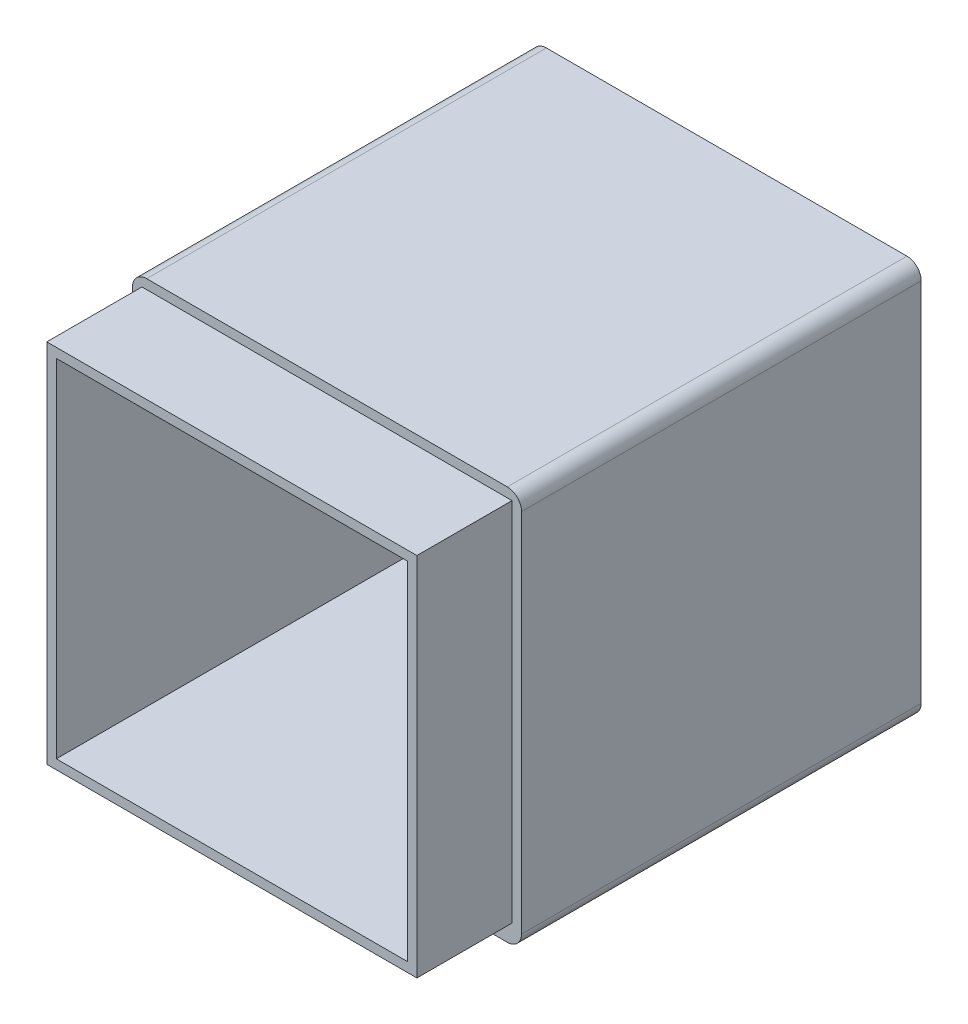
ISO-10303-21;
HEADER;
FILE_DESCRIPTION(('STEP AP214'),'2;1');
FILE_NAME('part.step','',(''),(''),'','','');
FILE_SCHEMA(('AUTOMOTIVE_DESIGN { 1 0 10303 214 1 1 1 1 }'));
ENDSEC;
DATA;
#1=APPLICATION_CONTEXT('core data for automotive mechanical design processes');
#2=APPLICATION_PROTOCOL_DEFINITION('international standard','automotive_design',2000,#1);
#3=PRODUCT_CONTEXT('',#1,'mechanical');
#4=PRODUCT('Part','Part','',(#3));
#5=PRODUCT_RELATED_PRODUCT_CATEGORY('part','',(#4));
#6=PRODUCT_DEFINITION_FORMATION('','',#4);
#7=PRODUCT_DEFINITION_CONTEXT('part definition',#1,'design');
#8=PRODUCT_DEFINITION('design','',#6,#7);
#9=PRODUCT_DEFINITION_SHAPE('','',#8);
#10=(LENGTH_UNIT() NAMED_UNIT(*) SI_UNIT(.MILLI.,.METRE.));
#11=(NAMED_UNIT(*) PLANE_ANGLE_UNIT() SI_UNIT($,.RADIAN.));
#12=(NAMED_UNIT(*) SI_UNIT($,.STERADIAN.) SOLID_ANGLE_UNIT());
#13=UNCERTAINTY_MEASURE_WITH_UNIT(LENGTH_MEASURE(1.E-05),#10,'distance_accuracy_value','');
#14=(GEOMETRIC_REPRESENTATION_CONTEXT(3) GLOBAL_UNCERTAINTY_ASSIGNED_CONTEXT((#13)) GLOBAL_UNIT_ASSIGNED_CONTEXT((#10,
#11,#12)) REPRESENTATION_CONTEXT('',''));
#15=CARTESIAN_POINT('',(0.,0.,0.));
#16=DIRECTION('',(0.,0.,1.));
#17=DIRECTION('',(1.,0.,0.));
#18=AXIS2_PLACEMENT_3D('',#15,#16,#17);
#19=CARTESIAN_POINT('',(0.,0.,80.));
#20=DIRECTION('',(0.,0.,1.));
#21=DIRECTION('',(1.,0.,0.));
#22=AXIS2_PLACEMENT_3D('',#19,#20,#21);
#23=PLANE('',#22);
#24=CARTESIAN_POINT('',(-37.8935,37.449,80.));
#25=DIRECTION('',(0.,0.,1.));
#26=DIRECTION('',(1.,0.,0.));
#27=AXIS2_PLACEMENT_3D('',#24,#25,#26);
#28=CIRCLE('',#27,3.);
#29=CARTESIAN_POINT('',(-40.8935,37.449,80.));
#30=VERTEX_POINT('',#29);
#31=CARTESIAN_POINT('',(-37.8935,40.449,80.));
#32=VERTEX_POINT('',#31);
#33=EDGE_CURVE('E258',#30,#32,#28,.F.);
#34=ORIENTED_EDGE('',*,*,#33,.F.);
#35=DIRECTION('',(0.,-1.,0.));
#36=VECTOR('',#35,1.);
#37=CARTESIAN_POINT('',(-40.8935,36.449,80.));
#38=LINE('',#37,#36);
#39=CARTESIAN_POINT('',(-40.8935,-39.449,80.));
#40=VERTEX_POINT('',#39);
#41=EDGE_CURVE('E266',#30,#40,#38,.T.);
#42=ORIENTED_EDGE('',*,*,#41,.T.);
#43=CARTESIAN_POINT('',(-37.8935,-39.449,80.));
#44=DIRECTION('',(0.,0.,1.));
#45=DIRECTION('',(1.,0.,0.));
#46=AXIS2_PLACEMENT_3D('',#43,#44,#45);
#47=CIRCLE('',#46,3.);
#48=CARTESIAN_POINT('',(-37.8935,-42.449,80.));
#49=VERTEX_POINT('',#48);
#50=EDGE_CURVE('E256',#49,#40,#47,.F.);
#51=ORIENTED_EDGE('',*,*,#50,.F.);
#52=DIRECTION('',(-1.,0.,0.));
#53=VECTOR('',#52,1.);
#54=CARTESIAN_POINT('',(0.,-42.449,80.));
#55=LINE('',#54,#53);
#56=CARTESIAN_POINT('',(37.8935,-42.449,80.));
#57=VERTEX_POINT('',#56);
#58=EDGE_CURVE('E260',#57,#49,#55,.T.);
#59=ORIENTED_EDGE('',*,*,#58,.F.);
#60=CARTESIAN_POINT('',(37.8935,-39.449,80.));
#61=DIRECTION('',(0.,0.,1.));
#62=DIRECTION('',(1.,0.,0.));
#63=AXIS2_PLACEMENT_3D('',#60,#61,#62);
#64=CIRCLE('',#63,3.);
#65=CARTESIAN_POINT('',(40.8935,-39.449,80.));
#66=VERTEX_POINT('',#65);
#67=EDGE_CURVE('E251',#66,#57,#64,.F.);
#68=ORIENTED_EDGE('',*,*,#67,.F.);
#69=DIRECTION('',(0.,1.,0.));
#70=VECTOR('',#69,1.);
#71=CARTESIAN_POINT('',(40.8935,36.449,80.));
#72=LINE('',#71,#70);
#73=CARTESIAN_POINT('',(40.8935,37.449,80.));
#74=VERTEX_POINT('',#73);
#75=EDGE_CURVE('E211',#66,#74,#72,.T.);
#76=ORIENTED_EDGE('',*,*,#75,.T.);
#77=CARTESIAN_POINT('',(37.8935,37.449,80.));
#78=DIRECTION('',(0.,0.,1.));
#79=DIRECTION('',(1.,0.,0.));
#80=AXIS2_PLACEMENT_3D('',#77,#78,#79);
#81=CIRCLE('',#80,3.);
#82=CARTESIAN_POINT('',(37.8935,40.449,80.));
#83=VERTEX_POINT('',#82);
#84=EDGE_CURVE('E254',#83,#74,#81,.F.);
#85=ORIENTED_EDGE('',*,*,#84,.F.);
#86=DIRECTION('',(-1.,0.,0.));
#87=VECTOR('',#86,1.);
#88=CARTESIAN_POINT('',(-36.8935,40.449,80.));
#89=LINE('',#88,#87);
#90=EDGE_CURVE('E263',#83,#32,#89,.T.);
#91=ORIENTED_EDGE('',*,*,#90,.T.);
#92=EDGE_LOOP('',(#34,#42,#51,#59,#68,#76,#85,#91));
#93=FACE_BOUND('',#92,.T.);
#94=DIRECTION('',(0.,-1.,0.));
#95=VECTOR('',#94,1.);
#96=CARTESIAN_POINT('',(-38.8935,38.449,80.));
#97=LINE('',#96,#95);
#98=CARTESIAN_POINT('',(-38.8935,38.449,80.));
#99=VERTEX_POINT('',#98);
#100=CARTESIAN_POINT('',(-38.8935,-38.449,80.));
#101=VERTEX_POINT('',#100);
#102=EDGE_CURVE('E198',#99,#101,#97,.T.);
#103=ORIENTED_EDGE('',*,*,#102,.F.);
#104=DIRECTION('',(-1.,0.,0.));
#105=VECTOR('',#104,1.);
#106=CARTESIAN_POINT('',(38.8935,38.449,80.));
#107=LINE('',#106,#105);
#108=CARTESIAN_POINT('',(38.8935,38.449,80.));
#109=VERTEX_POINT('',#108);
#110=EDGE_CURVE('E184',#109,#99,#107,.T.);
#111=ORIENTED_EDGE('',*,*,#110,.F.);
#112=DIRECTION('',(0.,1.,0.));
#113=VECTOR('',#112,1.);
#114=CARTESIAN_POINT('',(38.8935,-38.449,80.));
#115=LINE('',#114,#113);
#116=CARTESIAN_POINT('',(38.8935,-38.449,80.));
#117=VERTEX_POINT('',#116);
#118=EDGE_CURVE('E189',#117,#109,#115,.T.);
#119=ORIENTED_EDGE('',*,*,#118,.F.);
#120=DIRECTION('',(1.,0.,0.));
#121=VECTOR('',#120,1.);
#122=CARTESIAN_POINT('',(-38.8935,-38.449,80.));
#123=LINE('',#122,#121);
#124=EDGE_CURVE('E200',#101,#117,#123,.T.);
#125=ORIENTED_EDGE('',*,*,#124,.F.);
#126=EDGE_LOOP('',(#103,#111,#119,#125));
#127=FACE_BOUND('',#126,.T.);
#128=ADVANCED_FACE('F43',(#93,#127),#23,.T.);
#129=CARTESIAN_POINT('',(-22.225,-37.449,15.0499999999999));
#130=DIRECTION('',(0.,-1.,0.));
#131=DIRECTION('',(1.,0.,0.));
#132=AXIS2_PLACEMENT_3D('',#129,#130,#131);
#133=PLANE('',#132);
#134=CARTESIAN_POINT('',(-22.225,-37.449,15.0499999999999));
#135=DIRECTION('',(0.,-1.,0.));
#136=DIRECTION('',(1.,0.,0.));
#137=AXIS2_PLACEMENT_3D('',#134,#135,#136);
#138=CIRCLE('',#137,3.025);
#139=CARTESIAN_POINT('',(-19.2,-37.449,15.0499999999999));
#140=VERTEX_POINT('',#139);
#141=EDGE_CURVE('E244',#140,#140,#138,.T.);
#142=ORIENTED_EDGE('',*,*,#141,.T.);
#143=EDGE_LOOP('',(#142));
#144=FACE_BOUND('',#143,.T.);
#145=ADVANCED_FACE('F308',(#144),#133,.T.);
#146=CARTESIAN_POINT('',(22.225,-37.449,15.0499999999999));
#147=DIRECTION('',(0.,-1.,0.));
#148=DIRECTION('',(1.,0.,0.));
#149=AXIS2_PLACEMENT_3D('',#146,#147,#148);
#150=PLANE('',#149);
#151=CARTESIAN_POINT('',(22.225,-37.449,15.0499999999999));
#152=DIRECTION('',(0.,-1.,0.));
#153=DIRECTION('',(1.,0.,0.));
#154=AXIS2_PLACEMENT_3D('',#151,#152,#153);
#155=CIRCLE('',#154,3.025);
#156=CARTESIAN_POINT('',(25.25,-37.449,15.0499999999999));
#157=VERTEX_POINT('',#156);
#158=EDGE_CURVE('E11',#157,#157,#155,.T.);
#159=ORIENTED_EDGE('',*,*,#158,.T.);
#160=EDGE_LOOP('',(#159));
#161=FACE_BOUND('',#160,.T.);
#162=ADVANCED_FACE('F314',(#161),#150,.T.);
#163=CARTESIAN_POINT('',(-22.225,-37.449,15.0499999999999));
#164=DIRECTION('',(0.,-1.,0.));
#165=DIRECTION('',(1.,0.,0.));
#166=AXIS2_PLACEMENT_3D('',#163,#164,#165);
#167=CYLINDRICAL_SURFACE('',#166,3.025);
#168=ORIENTED_EDGE('',*,*,#141,.F.);
#169=EDGE_LOOP('',(#168));
#170=FACE_BOUND('',#169,.T.);
#171=CARTESIAN_POINT('',(-22.225,-42.449,15.0499999999999));
#172=DIRECTION('',(0.,-1.,0.));
#173=DIRECTION('',(1.,0.,0.));
#174=AXIS2_PLACEMENT_3D('',#171,#172,#173);
#175=CIRCLE('',#174,3.025);
#176=CARTESIAN_POINT('',(-19.2,-42.449,15.0499999999999));
#177=VERTEX_POINT('',#176);
#178=EDGE_CURVE('E243',#177,#177,#175,.T.);
#179=ORIENTED_EDGE('',*,*,#178,.T.);
#180=EDGE_LOOP('',(#179));
#181=FACE_BOUND('',#180,.T.);
#182=ADVANCED_FACE('F323',(#170,#181),#167,.F.);
#183=CARTESIAN_POINT('',(22.225,-37.449,15.0499999999999));
#184=DIRECTION('',(0.,-1.,0.));
#185=DIRECTION('',(1.,0.,0.));
#186=AXIS2_PLACEMENT_3D('',#183,#184,#185);
#187=CYLINDRICAL_SURFACE('',#186,3.025);
#188=ORIENTED_EDGE('',*,*,#158,.F.);
#189=EDGE_LOOP('',(#188));
#190=FACE_BOUND('',#189,.T.);
#191=CARTESIAN_POINT('',(22.225,-42.449,15.0499999999999));
#192=DIRECTION('',(0.,-1.,0.));
#193=DIRECTION('',(1.,0.,0.));
#194=AXIS2_PLACEMENT_3D('',#191,#192,#193);
#195=CIRCLE('',#194,3.025);
#196=CARTESIAN_POINT('',(25.25,-42.449,15.0499999999999));
#197=VERTEX_POINT('',#196);
#198=EDGE_CURVE('E52',#197,#197,#195,.T.);
#199=ORIENTED_EDGE('',*,*,#198,.T.);
#200=EDGE_LOOP('',(#199));
#201=FACE_BOUND('',#200,.T.);
#202=ADVANCED_FACE('F319',(#190,#201),#187,.F.);
#203=CARTESIAN_POINT('',(-40.8935,36.449,123.698));
#204=DIRECTION('',(1.,0.,0.));
#205=DIRECTION('',(0.,1.,0.));
#206=AXIS2_PLACEMENT_3D('',#203,#204,#205);
#207=PLANE('',#206);
#208=ORIENTED_EDGE('',*,*,#41,.F.);
#209=DIRECTION('',(0.,0.,-1.));
#210=VECTOR('',#209,1.);
#211=CARTESIAN_POINT('',(-40.8935,37.449,123.698));
#212=LINE('',#211,#210);
#213=CARTESIAN_POINT('',(-40.8935,37.449,-4.));
#214=VERTEX_POINT('',#213);
#215=EDGE_CURVE('E221',#30,#214,#212,.T.);
#216=ORIENTED_EDGE('',*,*,#215,.T.);
#217=DIRECTION('',(0.,-1.,0.));
#218=VECTOR('',#217,1.);
#219=CARTESIAN_POINT('',(-40.8935,0.,-4.));
#220=LINE('',#219,#218);
#221=CARTESIAN_POINT('',(-40.8935,-39.449,-4.));
#222=VERTEX_POINT('',#221);
#223=EDGE_CURVE('E225',#214,#222,#220,.T.);
#224=ORIENTED_EDGE('',*,*,#223,.T.);
#225=DIRECTION('',(0.,0.,-1.));
#226=VECTOR('',#225,1.);
#227=CARTESIAN_POINT('',(-40.8935,-39.449,128.698));
#228=LINE('',#227,#226);
#229=EDGE_CURVE('E226',#222,#40,#228,.F.);
#230=ORIENTED_EDGE('',*,*,#229,.T.);
#231=EDGE_LOOP('',(#208,#216,#224,#230));
#232=FACE_BOUND('',#231,.T.);
#233=ADVANCED_FACE('F322',(#232),#207,.F.);
#234=CARTESIAN_POINT('',(0.,0.,-4.));
#235=DIRECTION('',(0.,0.,-1.));
#236=DIRECTION('',(-1.,0.,0.));
#237=AXIS2_PLACEMENT_3D('',#234,#235,#236);
#238=PLANE('',#237);
#239=ORIENTED_EDGE('',*,*,#223,.F.);
#240=CARTESIAN_POINT('',(-37.8935,37.449,-4.));
#241=DIRECTION('',(0.,0.,-1.));
#242=DIRECTION('',(-1.,0.,0.));
#243=AXIS2_PLACEMENT_3D('',#240,#241,#242);
#244=CIRCLE('',#243,3.);
#245=CARTESIAN_POINT('',(-37.8935,40.449,-4.));
#246=VERTEX_POINT('',#245);
#247=EDGE_CURVE('E212',#214,#246,#244,.T.);
#248=ORIENTED_EDGE('',*,*,#247,.T.);
#249=DIRECTION('',(-1.,0.,0.));
#250=VECTOR('',#249,1.);
#251=CARTESIAN_POINT('',(0.,40.449,-4.));
#252=LINE('',#251,#250);
#253=CARTESIAN_POINT('',(37.8935,40.449,-4.));
#254=VERTEX_POINT('',#253);
#255=EDGE_CURVE('E229',#254,#246,#252,.T.);
#256=ORIENTED_EDGE('',*,*,#255,.F.);
#257=CARTESIAN_POINT('',(37.8935,37.449,-4.));
#258=DIRECTION('',(0.,0.,-1.));
#259=DIRECTION('',(-1.,0.,0.));
#260=AXIS2_PLACEMENT_3D('',#257,#258,#259);
#261=CIRCLE('',#260,3.);
#262=CARTESIAN_POINT('',(40.8935,37.449,-4.));
#263=VERTEX_POINT('',#262);
#264=EDGE_CURVE('E217',#254,#263,#261,.T.);
#265=ORIENTED_EDGE('',*,*,#264,.T.);
#266=DIRECTION('',(0.,1.,0.));
#267=VECTOR('',#266,1.);
#268=CARTESIAN_POINT('',(40.8935,0.,-4.));
#269=LINE('',#268,#267);
#270=CARTESIAN_POINT('',(40.8935,-39.449,-4.));
#271=VERTEX_POINT('',#270);
#272=EDGE_CURVE('E222',#271,#263,#269,.T.);
#273=ORIENTED_EDGE('',*,*,#272,.F.);
#274=CARTESIAN_POINT('',(37.8935,-39.449,-4.));
#275=DIRECTION('',(0.,0.,-1.));
#276=DIRECTION('',(-1.,0.,0.));
#277=AXIS2_PLACEMENT_3D('',#274,#275,#276);
#278=CIRCLE('',#277,3.);
#279=CARTESIAN_POINT('',(37.8935,-42.449,-4.));
#280=VERTEX_POINT('',#279);
#281=EDGE_CURVE('E219',#271,#280,#278,.T.);
#282=ORIENTED_EDGE('',*,*,#281,.T.);
#283=DIRECTION('',(1.,0.,0.));
#284=VECTOR('',#283,1.);
#285=CARTESIAN_POINT('',(-40.8935,-42.449,-4.));
#286=LINE('',#285,#284);
#287=CARTESIAN_POINT('',(-37.8935,-42.449,-4.));
#288=VERTEX_POINT('',#287);
#289=EDGE_CURVE('E240',#288,#280,#286,.T.);
#290=ORIENTED_EDGE('',*,*,#289,.F.);
#291=CARTESIAN_POINT('',(-37.8935,-39.449,-4.));
#292=DIRECTION('',(0.,0.,-1.));
#293=DIRECTION('',(-1.,0.,0.));
#294=AXIS2_PLACEMENT_3D('',#291,#292,#293);
#295=CIRCLE('',#294,3.);
#296=EDGE_CURVE('E214',#288,#222,#295,.T.);
#297=ORIENTED_EDGE('',*,*,#296,.T.);
#298=EDGE_LOOP('',(#239,#248,#256,#265,#273,#282,#290,#297));
#299=FACE_BOUND('',#298,.T.);
#300=ADVANCED_FACE('F334',(#299),#238,.T.);
#301=CARTESIAN_POINT('',(0.,-42.449,0.));
#302=DIRECTION('',(0.,-1.,0.));
#303=DIRECTION('',(1.,0.,0.));
#304=AXIS2_PLACEMENT_3D('',#301,#302,#303);
#305=PLANE('',#304);
#306=ORIENTED_EDGE('',*,*,#198,.F.);
#307=EDGE_LOOP('',(#306));
#308=FACE_BOUND('',#307,.T.);
#309=ORIENTED_EDGE('',*,*,#178,.F.);
#310=EDGE_LOOP('',(#309));
#311=FACE_BOUND('',#310,.T.);
#312=DIRECTION('',(0.,0.,1.));
#313=VECTOR('',#312,1.);
#314=CARTESIAN_POINT('',(37.8935,-42.449,128.698));
#315=LINE('',#314,#313);
#316=EDGE_CURVE('E277',#280,#57,#315,.T.);
#317=ORIENTED_EDGE('',*,*,#316,.T.);
#318=ORIENTED_EDGE('',*,*,#58,.T.);
#319=DIRECTION('',(0.,0.,-1.));
#320=VECTOR('',#319,1.);
#321=CARTESIAN_POINT('',(-37.8935,-42.449,-4.));
#322=LINE('',#321,#320);
#323=EDGE_CURVE('E275',#49,#288,#322,.T.);
#324=ORIENTED_EDGE('',*,*,#323,.T.);
#325=ORIENTED_EDGE('',*,*,#289,.T.);
#326=EDGE_LOOP('',(#317,#318,#324,#325));
#327=FACE_BOUND('',#326,.T.);
#328=ADVANCED_FACE('F337',(#308,#311,#327),#305,.T.);
#329=CARTESIAN_POINT('',(40.8935,36.449,123.698));
#330=DIRECTION('',(-1.,0.,0.));
#331=DIRECTION('',(0.,0.,1.));
#332=AXIS2_PLACEMENT_3D('',#329,#330,#331);
#333=PLANE('',#332);
#334=ORIENTED_EDGE('',*,*,#75,.F.);
#335=DIRECTION('',(0.,0.,1.));
#336=VECTOR('',#335,1.);
#337=CARTESIAN_POINT('',(40.8935,-39.449,-4.));
#338=LINE('',#337,#336);
#339=EDGE_CURVE('E273',#66,#271,#338,.F.);
#340=ORIENTED_EDGE('',*,*,#339,.T.);
#341=ORIENTED_EDGE('',*,*,#272,.T.);
#342=DIRECTION('',(0.,0.,-1.));
#343=VECTOR('',#342,1.);
#344=CARTESIAN_POINT('',(40.8935,37.449,123.698));
#345=LINE('',#344,#343);
#346=EDGE_CURVE('E253',#263,#74,#345,.F.);
#347=ORIENTED_EDGE('',*,*,#346,.T.);
#348=EDGE_LOOP('',(#334,#340,#341,#347));
#349=FACE_BOUND('',#348,.T.);
#350=ADVANCED_FACE('F402',(#349),#333,.F.);
#351=CARTESIAN_POINT('',(37.8935,-39.449,0.));
#352=DIRECTION('',(0.,0.,-1.));
#353=DIRECTION('',(-1.,0.,0.));
#354=AXIS2_PLACEMENT_3D('',#351,#352,#353);
#355=CYLINDRICAL_SURFACE('',#354,3.);
#356=ORIENTED_EDGE('',*,*,#339,.F.);
#357=ORIENTED_EDGE('',*,*,#67,.T.);
#358=ORIENTED_EDGE('',*,*,#316,.F.);
#359=ORIENTED_EDGE('',*,*,#281,.F.);
#360=EDGE_LOOP('',(#356,#357,#358,#359));
#361=FACE_BOUND('',#360,.T.);
#362=ADVANCED_FACE('F45',(#361),#355,.T.);
#363=CARTESIAN_POINT('',(-36.8935,40.449,123.698));
#364=DIRECTION('',(0.,-1.,0.));
#365=DIRECTION('',(0.,0.,-1.));
#366=AXIS2_PLACEMENT_3D('',#363,#364,#365);
#367=PLANE('',#366);
#368=ORIENTED_EDGE('',*,*,#90,.F.);
#369=DIRECTION('',(0.,0.,-1.));
#370=VECTOR('',#369,1.);
#371=CARTESIAN_POINT('',(37.8935,40.449,123.698));
#372=LINE('',#371,#370);
#373=EDGE_CURVE('E215',#83,#254,#372,.T.);
#374=ORIENTED_EDGE('',*,*,#373,.T.);
#375=ORIENTED_EDGE('',*,*,#255,.T.);
#376=DIRECTION('',(0.,0.,-1.));
#377=VECTOR('',#376,1.);
#378=CARTESIAN_POINT('',(-37.8935,40.449,123.698));
#379=LINE('',#378,#377);
#380=EDGE_CURVE('E280',#246,#32,#379,.F.);
#381=ORIENTED_EDGE('',*,*,#380,.T.);
#382=EDGE_LOOP('',(#368,#374,#375,#381));
#383=FACE_BOUND('',#382,.T.);
#384=ADVANCED_FACE('F383',(#383),#367,.F.);
#385=CARTESIAN_POINT('',(37.8935,37.449,123.698));
#386=DIRECTION('',(0.,0.,-1.));
#387=DIRECTION('',(-1.,0.,0.));
#388=AXIS2_PLACEMENT_3D('',#385,#386,#387);
#389=CYLINDRICAL_SURFACE('',#388,3.);
#390=ORIENTED_EDGE('',*,*,#373,.F.);
#391=ORIENTED_EDGE('',*,*,#84,.T.);
#392=ORIENTED_EDGE('',*,*,#346,.F.);
#393=ORIENTED_EDGE('',*,*,#264,.F.);
#394=EDGE_LOOP('',(#390,#391,#392,#393));
#395=FACE_BOUND('',#394,.T.);
#396=ADVANCED_FACE('F376',(#395),#389,.T.);
#397=CARTESIAN_POINT('',(-37.8935,-39.449,0.));
#398=DIRECTION('',(0.,0.,1.));
#399=DIRECTION('',(1.,0.,0.));
#400=AXIS2_PLACEMENT_3D('',#397,#398,#399);
#401=CYLINDRICAL_SURFACE('',#400,3.);
#402=ORIENTED_EDGE('',*,*,#323,.F.);
#403=ORIENTED_EDGE('',*,*,#50,.T.);
#404=ORIENTED_EDGE('',*,*,#229,.F.);
#405=ORIENTED_EDGE('',*,*,#296,.F.);
#406=EDGE_LOOP('',(#402,#403,#404,#405));
#407=FACE_BOUND('',#406,.T.);
#408=ADVANCED_FACE('F360',(#407),#401,.T.);
#409=CARTESIAN_POINT('',(-37.8935,37.449,123.698));
#410=DIRECTION('',(0.,0.,-1.));
#411=DIRECTION('',(-1.,0.,0.));
#412=AXIS2_PLACEMENT_3D('',#409,#410,#411);
#413=CYLINDRICAL_SURFACE('',#412,3.);
#414=ORIENTED_EDGE('',*,*,#215,.F.);
#415=ORIENTED_EDGE('',*,*,#33,.T.);
#416=ORIENTED_EDGE('',*,*,#380,.F.);
#417=ORIENTED_EDGE('',*,*,#247,.F.);
#418=EDGE_LOOP('',(#414,#415,#416,#417));
#419=FACE_BOUND('',#418,.T.);
#420=ADVANCED_FACE('F354',(#419),#413,.T.);
#421=CARTESIAN_POINT('',(0.,0.,100.));
#422=DIRECTION('',(0.,0.,1.));
#423=DIRECTION('',(1.,0.,0.));
#424=AXIS2_PLACEMENT_3D('',#421,#422,#423);
#425=PLANE('',#424);
#426=DIRECTION('',(-1.,0.,0.));
#427=VECTOR('',#426,1.);
#428=CARTESIAN_POINT('',(38.8935,38.449,100.));
#429=LINE('',#428,#427);
#430=CARTESIAN_POINT('',(38.8935,38.449,100.));
#431=VERTEX_POINT('',#430);
#432=CARTESIAN_POINT('',(-38.8935,38.449,100.));
#433=VERTEX_POINT('',#432);
#434=EDGE_CURVE('E185',#431,#433,#429,.T.);
#435=ORIENTED_EDGE('',*,*,#434,.T.);
#436=DIRECTION('',(0.,-1.,0.));
#437=VECTOR('',#436,1.);
#438=CARTESIAN_POINT('',(-38.8935,38.449,100.));
#439=LINE('',#438,#437);
#440=CARTESIAN_POINT('',(-38.8935,-38.449,100.));
#441=VERTEX_POINT('',#440);
#442=EDGE_CURVE('E188',#433,#441,#439,.T.);
#443=ORIENTED_EDGE('',*,*,#442,.T.);
#444=DIRECTION('',(1.,0.,0.));
#445=VECTOR('',#444,1.);
#446=CARTESIAN_POINT('',(-38.8935,-38.449,100.));
#447=LINE('',#446,#445);
#448=CARTESIAN_POINT('',(38.8935,-38.449,100.));
#449=VERTEX_POINT('',#448);
#450=EDGE_CURVE('E191',#441,#449,#447,.T.);
#451=ORIENTED_EDGE('',*,*,#450,.T.);
#452=DIRECTION('',(0.,1.,0.));
#453=VECTOR('',#452,1.);
#454=CARTESIAN_POINT('',(38.8935,-38.449,100.));
#455=LINE('',#454,#453);
#456=EDGE_CURVE('E193',#449,#431,#455,.T.);
#457=ORIENTED_EDGE('',*,*,#456,.T.);
#458=EDGE_LOOP('',(#435,#443,#451,#457));
#459=FACE_BOUND('',#458,.T.);
#460=DIRECTION('',(-1.,0.,0.));
#461=VECTOR('',#460,1.);
#462=CARTESIAN_POINT('',(36.8935,36.449,100.));
#463=LINE('',#462,#461);
#464=CARTESIAN_POINT('',(36.8935,36.449,100.));
#465=VERTEX_POINT('',#464);
#466=CARTESIAN_POINT('',(-36.8935,36.449,100.));
#467=VERTEX_POINT('',#466);
#468=EDGE_CURVE('E160',#465,#467,#463,.T.);
#469=ORIENTED_EDGE('',*,*,#468,.F.);
#470=DIRECTION('',(0.,1.,0.));
#471=VECTOR('',#470,1.);
#472=CARTESIAN_POINT('',(36.8935,-36.449,100.));
#473=LINE('',#472,#471);
#474=CARTESIAN_POINT('',(36.8935,-36.449,100.));
#475=VERTEX_POINT('',#474);
#476=EDGE_CURVE('E170',#475,#465,#473,.T.);
#477=ORIENTED_EDGE('',*,*,#476,.F.);
#478=DIRECTION('',(1.,0.,0.));
#479=VECTOR('',#478,1.);
#480=CARTESIAN_POINT('',(-36.8935,-36.449,100.));
#481=LINE('',#480,#479);
#482=CARTESIAN_POINT('',(-36.8935,-36.449,100.));
#483=VERTEX_POINT('',#482);
#484=EDGE_CURVE('E180',#483,#475,#481,.T.);
#485=ORIENTED_EDGE('',*,*,#484,.F.);
#486=DIRECTION('',(0.,-1.,0.));
#487=VECTOR('',#486,1.);
#488=CARTESIAN_POINT('',(-36.8935,36.449,100.));
#489=LINE('',#488,#487);
#490=EDGE_CURVE('E178',#467,#483,#489,.T.);
#491=ORIENTED_EDGE('',*,*,#490,.F.);
#492=EDGE_LOOP('',(#469,#477,#485,#491));
#493=FACE_BOUND('',#492,.T.);
#494=ADVANCED_FACE('F176',(#459,#493),#425,.T.);
#495=CARTESIAN_POINT('',(38.8935,38.449,100.));
#496=DIRECTION('',(0.,-1.,0.));
#497=DIRECTION('',(1.,0.,0.));
#498=AXIS2_PLACEMENT_3D('',#495,#496,#497);
#499=PLANE('',#498);
#500=ORIENTED_EDGE('',*,*,#110,.T.);
#501=DIRECTION('',(0.,0.,-1.));
#502=VECTOR('',#501,1.);
#503=CARTESIAN_POINT('',(-38.8935,38.449,100.));
#504=LINE('',#503,#502);
#505=EDGE_CURVE('E209',#433,#99,#504,.T.);
#506=ORIENTED_EDGE('',*,*,#505,.F.);
#507=ORIENTED_EDGE('',*,*,#434,.F.);
#508=DIRECTION('',(0.,0.,-1.));
#509=VECTOR('',#508,1.);
#510=CARTESIAN_POINT('',(38.8935,38.449,100.));
#511=LINE('',#510,#509);
#512=EDGE_CURVE('E195',#431,#109,#511,.T.);
#513=ORIENTED_EDGE('',*,*,#512,.T.);
#514=EDGE_LOOP('',(#500,#506,#507,#513));
#515=FACE_BOUND('',#514,.T.);
#516=ADVANCED_FACE('F339',(#515),#499,.F.);
#517=CARTESIAN_POINT('',(-38.8935,38.449,100.));
#518=DIRECTION('',(1.,0.,0.));
#519=DIRECTION('',(0.,1.,0.));
#520=AXIS2_PLACEMENT_3D('',#517,#518,#519);
#521=PLANE('',#520);
#522=ORIENTED_EDGE('',*,*,#102,.T.);
#523=DIRECTION('',(0.,0.,-1.));
#524=VECTOR('',#523,1.);
#525=CARTESIAN_POINT('',(-38.8935,-38.449,100.));
#526=LINE('',#525,#524);
#527=EDGE_CURVE('E206',#441,#101,#526,.T.);
#528=ORIENTED_EDGE('',*,*,#527,.F.);
#529=ORIENTED_EDGE('',*,*,#442,.F.);
#530=ORIENTED_EDGE('',*,*,#505,.T.);
#531=EDGE_LOOP('',(#522,#528,#529,#530));
#532=FACE_BOUND('',#531,.T.);
#533=ADVANCED_FACE('F342',(#532),#521,.F.);
#534=CARTESIAN_POINT('',(-38.8935,-38.449,100.));
#535=DIRECTION('',(0.,1.,0.));
#536=DIRECTION('',(-1.,0.,0.));
#537=AXIS2_PLACEMENT_3D('',#534,#535,#536);
#538=PLANE('',#537);
#539=ORIENTED_EDGE('',*,*,#124,.T.);
#540=DIRECTION('',(0.,0.,-1.));
#541=VECTOR('',#540,1.);
#542=CARTESIAN_POINT('',(38.8935,-38.449,100.));
#543=LINE('',#542,#541);
#544=EDGE_CURVE('E60',#449,#117,#543,.T.);
#545=ORIENTED_EDGE('',*,*,#544,.F.);
#546=ORIENTED_EDGE('',*,*,#450,.F.);
#547=ORIENTED_EDGE('',*,*,#527,.T.);
#548=EDGE_LOOP('',(#539,#545,#546,#547));
#549=FACE_BOUND('',#548,.T.);
#550=ADVANCED_FACE('F346',(#549),#538,.F.);
#551=CARTESIAN_POINT('',(38.8935,-38.449,100.));
#552=DIRECTION('',(-1.,0.,0.));
#553=DIRECTION('',(0.,0.,1.));
#554=AXIS2_PLACEMENT_3D('',#551,#552,#553);
#555=PLANE('',#554);
#556=ORIENTED_EDGE('',*,*,#118,.T.);
#557=ORIENTED_EDGE('',*,*,#512,.F.);
#558=ORIENTED_EDGE('',*,*,#456,.F.);
#559=ORIENTED_EDGE('',*,*,#544,.T.);
#560=EDGE_LOOP('',(#556,#557,#558,#559));
#561=FACE_BOUND('',#560,.T.);
#562=ADVANCED_FACE('F333',(#561),#555,.F.);
#563=CARTESIAN_POINT('',(0.,0.,0.));
#564=DIRECTION('',(0.,0.,-1.));
#565=DIRECTION('',(-1.,0.,0.));
#566=AXIS2_PLACEMENT_3D('',#563,#564,#565);
#567=PLANE('',#566);
#568=DIRECTION('',(-1.,0.,0.));
#569=VECTOR('',#568,1.);
#570=CARTESIAN_POINT('',(-36.8935,36.449,0.));
#571=LINE('',#570,#569);
#572=CARTESIAN_POINT('',(36.8935,36.449,0.));
#573=VERTEX_POINT('',#572);
#574=CARTESIAN_POINT('',(-36.8935,36.449,0.));
#575=VERTEX_POINT('',#574);
#576=EDGE_CURVE('E163',#573,#575,#571,.T.);
#577=ORIENTED_EDGE('',*,*,#576,.T.);
#578=DIRECTION('',(0.,-1.,0.));
#579=VECTOR('',#578,1.);
#580=CARTESIAN_POINT('',(-36.8935,36.449,0.));
#581=LINE('',#580,#579);
#582=CARTESIAN_POINT('',(-36.8935,-36.449,0.));
#583=VERTEX_POINT('',#582);
#584=EDGE_CURVE('E236',#575,#583,#581,.T.);
#585=ORIENTED_EDGE('',*,*,#584,.T.);
#586=DIRECTION('',(1.,0.,0.));
#587=VECTOR('',#586,1.);
#588=CARTESIAN_POINT('',(-36.8935,-36.449,0.));
#589=LINE('',#588,#587);
#590=CARTESIAN_POINT('',(36.8935,-36.449,0.));
#591=VERTEX_POINT('',#590);
#592=EDGE_CURVE('E233',#583,#591,#589,.T.);
#593=ORIENTED_EDGE('',*,*,#592,.T.);
#594=DIRECTION('',(0.,1.,0.));
#595=VECTOR('',#594,1.);
#596=CARTESIAN_POINT('',(36.8935,36.449,0.));
#597=LINE('',#596,#595);
#598=EDGE_CURVE('E167',#591,#573,#597,.T.);
#599=ORIENTED_EDGE('',*,*,#598,.T.);
#600=EDGE_LOOP('',(#577,#585,#593,#599));
#601=FACE_BOUND('',#600,.T.);
#602=ADVANCED_FACE('F293',(#601),#567,.F.);
#603=CARTESIAN_POINT('',(-36.8935,36.449,123.698));
#604=DIRECTION('',(0.,-1.,0.));
#605=DIRECTION('',(0.,0.,-1.));
#606=AXIS2_PLACEMENT_3D('',#603,#604,#605);
#607=PLANE('',#606);
#608=DIRECTION('',(0.,0.,-1.));
#609=VECTOR('',#608,1.);
#610=CARTESIAN_POINT('',(36.8935,36.449,123.698));
#611=LINE('',#610,#609);
#612=EDGE_CURVE('E47',#465,#573,#611,.T.);
#613=ORIENTED_EDGE('',*,*,#612,.F.);
#614=ORIENTED_EDGE('',*,*,#468,.T.);
#615=DIRECTION('',(0.,0.,-1.));
#616=VECTOR('',#615,1.);
#617=CARTESIAN_POINT('',(-36.8935,36.449,123.698));
#618=LINE('',#617,#616);
#619=EDGE_CURVE('E68',#467,#575,#618,.T.);
#620=ORIENTED_EDGE('',*,*,#619,.T.);
#621=ORIENTED_EDGE('',*,*,#576,.F.);
#622=EDGE_LOOP('',(#613,#614,#620,#621));
#623=FACE_BOUND('',#622,.T.);
#624=ADVANCED_FACE('F158',(#623),#607,.T.);
#625=CARTESIAN_POINT('',(36.8935,36.449,123.698));
#626=DIRECTION('',(-1.,0.,0.));
#627=DIRECTION('',(0.,0.,1.));
#628=AXIS2_PLACEMENT_3D('',#625,#626,#627);
#629=PLANE('',#628);
#630=DIRECTION('',(0.,0.,-1.));
#631=VECTOR('',#630,1.);
#632=CARTESIAN_POINT('',(36.8935,-36.449,123.698));
#633=LINE('',#632,#631);
#634=EDGE_CURVE('E168',#475,#591,#633,.T.);
#635=ORIENTED_EDGE('',*,*,#634,.F.);
#636=ORIENTED_EDGE('',*,*,#476,.T.);
#637=ORIENTED_EDGE('',*,*,#612,.T.);
#638=ORIENTED_EDGE('',*,*,#598,.F.);
#639=EDGE_LOOP('',(#635,#636,#637,#638));
#640=FACE_BOUND('',#639,.T.);
#641=ADVANCED_FACE('F171',(#640),#629,.T.);
#642=CARTESIAN_POINT('',(-36.8935,36.449,123.698));
#643=DIRECTION('',(1.,0.,0.));
#644=DIRECTION('',(0.,1.,0.));
#645=AXIS2_PLACEMENT_3D('',#642,#643,#644);
#646=PLANE('',#645);
#647=ORIENTED_EDGE('',*,*,#619,.F.);
#648=ORIENTED_EDGE('',*,*,#490,.T.);
#649=DIRECTION('',(0.,0.,-1.));
#650=VECTOR('',#649,1.);
#651=CARTESIAN_POINT('',(-36.8935,-36.449,123.698));
#652=LINE('',#651,#650);
#653=EDGE_CURVE('E288',#483,#583,#652,.T.);
#654=ORIENTED_EDGE('',*,*,#653,.T.);
#655=ORIENTED_EDGE('',*,*,#584,.F.);
#656=EDGE_LOOP('',(#647,#648,#654,#655));
#657=FACE_BOUND('',#656,.T.);
#658=ADVANCED_FACE('F295',(#657),#646,.T.);
#659=CARTESIAN_POINT('',(-36.8935,-36.449,123.698));
#660=DIRECTION('',(0.,1.,0.));
#661=DIRECTION('',(-1.,0.,0.));
#662=AXIS2_PLACEMENT_3D('',#659,#660,#661);
#663=PLANE('',#662);
#664=ORIENTED_EDGE('',*,*,#653,.F.);
#665=ORIENTED_EDGE('',*,*,#484,.T.);
#666=ORIENTED_EDGE('',*,*,#634,.T.);
#667=ORIENTED_EDGE('',*,*,#592,.F.);
#668=EDGE_LOOP('',(#664,#665,#666,#667));
#669=FACE_BOUND('',#668,.T.);
#670=ADVANCED_FACE('F291',(#669),#663,.T.);
#671=CLOSED_SHELL('',(#128,#145,#162,#182,#202,#233,#300,#328,#350,#362,#384,#396,#408,#420,
#494,#516,#533,#550,#562,#602,#624,#641,#658,#670));
#672=MANIFOLD_SOLID_BREP('B2',#671);
#673=ADVANCED_BREP_SHAPE_REPRESENTATION('',(#18,#672),#14);
#674=SHAPE_DEFINITION_REPRESENTATION(#9,#673);
ENDSEC;
END-ISO-10303-21;
